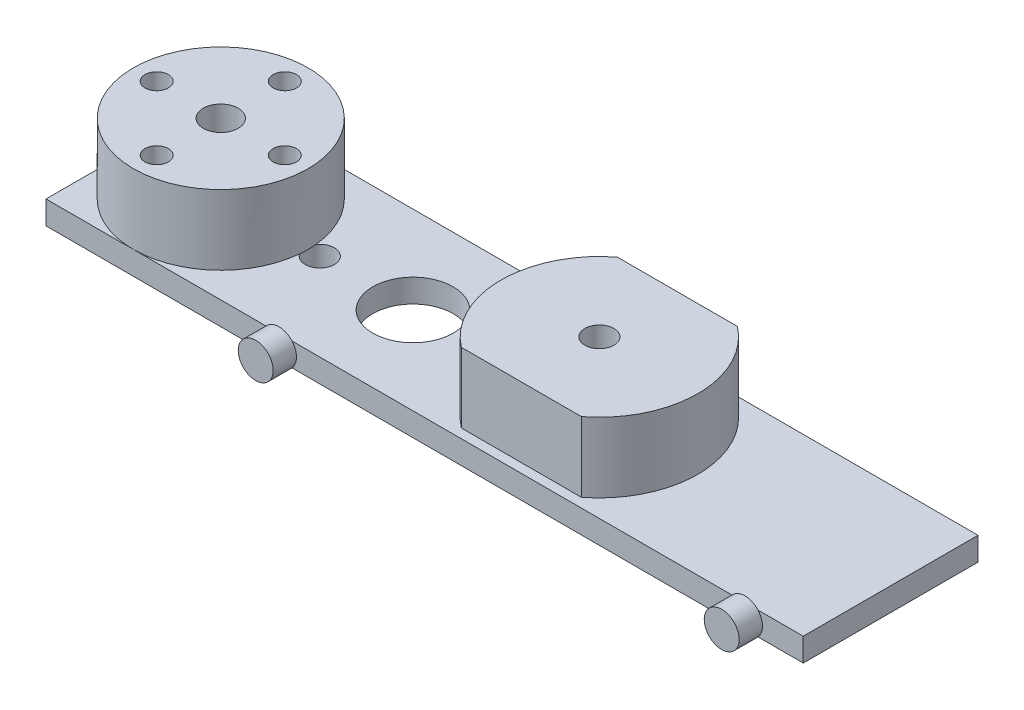
ISO-10303-21;
HEADER;
FILE_DESCRIPTION(('STEP AP214'),'2;1');
FILE_NAME('part.step','',(''),(''),'','','');
FILE_SCHEMA(('AUTOMOTIVE_DESIGN { 1 0 10303 214 1 1 1 1 }'));
ENDSEC;
DATA;
#1=APPLICATION_CONTEXT('core data for automotive mechanical design processes');
#2=APPLICATION_PROTOCOL_DEFINITION('international standard','automotive_design',2000,#1);
#3=PRODUCT_CONTEXT('',#1,'mechanical');
#4=PRODUCT('Part','Part','',(#3));
#5=PRODUCT_RELATED_PRODUCT_CATEGORY('part','',(#4));
#6=PRODUCT_DEFINITION_FORMATION('','',#4);
#7=PRODUCT_DEFINITION_CONTEXT('part definition',#1,'design');
#8=PRODUCT_DEFINITION('design','',#6,#7);
#9=PRODUCT_DEFINITION_SHAPE('','',#8);
#10=(LENGTH_UNIT() NAMED_UNIT(*) SI_UNIT(.MILLI.,.METRE.));
#11=(NAMED_UNIT(*) PLANE_ANGLE_UNIT() SI_UNIT($,.RADIAN.));
#12=(NAMED_UNIT(*) SI_UNIT($,.STERADIAN.) SOLID_ANGLE_UNIT());
#13=UNCERTAINTY_MEASURE_WITH_UNIT(LENGTH_MEASURE(1.E-05),#10,'distance_accuracy_value','');
#14=(GEOMETRIC_REPRESENTATION_CONTEXT(3) GLOBAL_UNCERTAINTY_ASSIGNED_CONTEXT((#13)) GLOBAL_UNIT_ASSIGNED_CONTEXT((#10,
#11,#12)) REPRESENTATION_CONTEXT('',''));
#15=CARTESIAN_POINT('',(0.,0.,0.));
#16=DIRECTION('',(0.,0.,1.));
#17=DIRECTION('',(1.,0.,0.));
#18=AXIS2_PLACEMENT_3D('',#15,#16,#17);
#19=CARTESIAN_POINT('',(0.,0.,0.));
#20=DIRECTION('',(0.,1.,0.));
#21=DIRECTION('',(0.,0.,1.));
#22=AXIS2_PLACEMENT_3D('',#19,#20,#21);
#23=PLANE('',#22);
#24=DIRECTION('',(0.,0.,-1.));
#25=VECTOR('',#24,1.);
#26=CARTESIAN_POINT('',(-40.,0.,0.));
#27=LINE('',#26,#25);
#28=CARTESIAN_POINT('',(-40.,0.,7.5));
#29=VERTEX_POINT('',#28);
#30=CARTESIAN_POINT('',(-40.,0.,-7.5));
#31=VERTEX_POINT('',#30);
#32=EDGE_CURVE('E406',#29,#31,#27,.T.);
#33=ORIENTED_EDGE('',*,*,#32,.T.);
#34=DIRECTION('',(-1.,0.,0.));
#35=VECTOR('',#34,1.);
#36=CARTESIAN_POINT('',(0.,0.,-7.5));
#37=LINE('',#36,#35);
#38=CARTESIAN_POINT('',(25.,0.,-7.5));
#39=VERTEX_POINT('',#38);
#40=EDGE_CURVE('E416',#39,#31,#37,.T.);
#41=ORIENTED_EDGE('',*,*,#40,.F.);
#42=DIRECTION('',(0.,0.,1.));
#43=VECTOR('',#42,1.);
#44=CARTESIAN_POINT('',(25.,0.,-7.5));
#45=LINE('',#44,#43);
#46=CARTESIAN_POINT('',(25.,0.,7.5));
#47=VERTEX_POINT('',#46);
#48=EDGE_CURVE('E382',#39,#47,#45,.T.);
#49=ORIENTED_EDGE('',*,*,#48,.T.);
#50=DIRECTION('',(-1.,0.,0.));
#51=VECTOR('',#50,1.);
#52=CARTESIAN_POINT('',(0.,0.,7.5));
#53=LINE('',#52,#51);
#54=CARTESIAN_POINT('',(21.1180339887499,0.,7.5));
#55=VERTEX_POINT('',#54);
#56=EDGE_CURVE('E412',#47,#55,#53,.T.);
#57=ORIENTED_EDGE('',*,*,#56,.T.);
#58=CARTESIAN_POINT('',(18.8819660112501,0.,7.5));
#59=VERTEX_POINT('',#58);
#60=EDGE_CURVE('E417',#55,#59,#53,.T.);
#61=ORIENTED_EDGE('',*,*,#60,.T.);
#62=CARTESIAN_POINT('',(-18.8819660112501,0.,7.5));
#63=VERTEX_POINT('',#62);
#64=EDGE_CURVE('E662',#59,#63,#53,.T.);
#65=ORIENTED_EDGE('',*,*,#64,.T.);
#66=CARTESIAN_POINT('',(-21.1180339887499,0.,7.5));
#67=VERTEX_POINT('',#66);
#68=EDGE_CURVE('E618',#63,#67,#53,.T.);
#69=ORIENTED_EDGE('',*,*,#68,.T.);
#70=EDGE_CURVE('E410',#67,#29,#53,.T.);
#71=ORIENTED_EDGE('',*,*,#70,.T.);
#72=EDGE_LOOP('',(#33,#41,#49,#57,#61,#65,#69,#71));
#73=FACE_BOUND('',#72,.T.);
#74=CARTESIAN_POINT('',(-24.,0.,0.));
#75=DIRECTION('',(0.,-1.,0.));
#76=DIRECTION('',(0.,0.,-1.));
#77=AXIS2_PLACEMENT_3D('',#74,#75,#76);
#78=CIRCLE('',#77,1.25);
#79=CARTESIAN_POINT('',(-24.,0.,-1.25));
#80=VERTEX_POINT('',#79);
#81=EDGE_CURVE('E377',#80,#80,#78,.T.);
#82=ORIENTED_EDGE('',*,*,#81,.F.);
#83=EDGE_LOOP('',(#82));
#84=FACE_BOUND('',#83,.T.);
#85=CARTESIAN_POINT('',(-16.,0.,0.));
#86=DIRECTION('',(0.,-1.,0.));
#87=DIRECTION('',(0.,0.,-1.));
#88=AXIS2_PLACEMENT_3D('',#85,#86,#87);
#89=CIRCLE('',#88,3.45);
#90=CARTESIAN_POINT('',(-16.,0.,-3.45));
#91=VERTEX_POINT('',#90);
#92=EDGE_CURVE('E386',#91,#91,#89,.T.);
#93=ORIENTED_EDGE('',*,*,#92,.F.);
#94=EDGE_LOOP('',(#93));
#95=FACE_BOUND('',#94,.T.);
#96=CARTESIAN_POINT('',(-32.5,0.,0.));
#97=DIRECTION('',(0.,1.,0.));
#98=DIRECTION('',(0.,0.,1.));
#99=AXIS2_PLACEMENT_3D('',#96,#97,#98);
#100=CIRCLE('',#99,7.2);
#101=CARTESIAN_POINT('',(-32.5,0.,7.2));
#102=VERTEX_POINT('',#101);
#103=EDGE_CURVE('E289',#102,#102,#100,.T.);
#104=ORIENTED_EDGE('',*,*,#103,.T.);
#105=EDGE_LOOP('',(#104));
#106=FACE_BOUND('',#105,.T.);
#107=DIRECTION('',(-1.,0.,0.));
#108=VECTOR('',#107,1.);
#109=CARTESIAN_POINT('',(0.,0.,6.));
#110=LINE('',#109,#108);
#111=CARTESIAN_POINT('',(4.90535421758714,0.,6.));
#112=VERTEX_POINT('',#111);
#113=CARTESIAN_POINT('',(-4.90535421758714,0.,6.));
#114=VERTEX_POINT('',#113);
#115=EDGE_CURVE('E13',#112,#114,#110,.T.);
#116=ORIENTED_EDGE('',*,*,#115,.F.);
#117=CARTESIAN_POINT('',(0.,0.,0.));
#118=DIRECTION('',(0.,1.,0.));
#119=DIRECTION('',(0.,0.,1.));
#120=AXIS2_PLACEMENT_3D('',#117,#118,#119);
#121=CIRCLE('',#120,7.75);
#122=CARTESIAN_POINT('',(4.90535421758714,0.,-6.));
#123=VERTEX_POINT('',#122);
#124=EDGE_CURVE('E444',#112,#123,#121,.T.);
#125=ORIENTED_EDGE('',*,*,#124,.T.);
#126=DIRECTION('',(-1.,0.,0.));
#127=VECTOR('',#126,1.);
#128=CARTESIAN_POINT('',(0.,0.,-6.));
#129=LINE('',#128,#127);
#130=CARTESIAN_POINT('',(-4.90535421758714,0.,-6.));
#131=VERTEX_POINT('',#130);
#132=EDGE_CURVE('E448',#123,#131,#129,.T.);
#133=ORIENTED_EDGE('',*,*,#132,.T.);
#134=CARTESIAN_POINT('',(0.,0.,0.));
#135=DIRECTION('',(0.,1.,0.));
#136=DIRECTION('',(0.,0.,1.));
#137=AXIS2_PLACEMENT_3D('',#134,#135,#136);
#138=CIRCLE('',#137,7.75);
#139=EDGE_CURVE('E131',#131,#114,#138,.T.);
#140=ORIENTED_EDGE('',*,*,#139,.T.);
#141=EDGE_LOOP('',(#116,#125,#133,#140));
#142=FACE_BOUND('',#141,.T.);
#143=ADVANCED_FACE('F121',(#73,#84,#95,#106,#142),#23,.F.);
#144=CARTESIAN_POINT('',(0.,2.,0.));
#145=DIRECTION('',(0.,1.,0.));
#146=DIRECTION('',(0.,0.,1.));
#147=AXIS2_PLACEMENT_3D('',#144,#145,#146);
#148=PLANE('',#147);
#149=CARTESIAN_POINT('',(-16.,2.,0.));
#150=DIRECTION('',(0.,1.,0.));
#151=DIRECTION('',(0.,0.,1.));
#152=AXIS2_PLACEMENT_3D('',#149,#150,#151);
#153=CIRCLE('',#152,3.45);
#154=CARTESIAN_POINT('',(-16.,2.,3.45));
#155=VERTEX_POINT('',#154);
#156=EDGE_CURVE('E357',#155,#155,#153,.F.);
#157=ORIENTED_EDGE('',*,*,#156,.T.);
#158=EDGE_LOOP('',(#157));
#159=FACE_BOUND('',#158,.T.);
#160=DIRECTION('',(-1.,0.,0.));
#161=VECTOR('',#160,1.);
#162=CARTESIAN_POINT('',(5.14902903468217,2.,-6.7));
#163=LINE('',#162,#161);
#164=CARTESIAN_POINT('',(5.14902903468217,2.,-6.7));
#165=VERTEX_POINT('',#164);
#166=CARTESIAN_POINT('',(-5.14902903468217,2.,-6.7));
#167=VERTEX_POINT('',#166);
#168=EDGE_CURVE('E335',#165,#167,#163,.T.);
#169=ORIENTED_EDGE('',*,*,#168,.F.);
#170=CARTESIAN_POINT('',(0.,2.,0.));
#171=DIRECTION('',(0.,1.,0.));
#172=DIRECTION('',(0.,0.,1.));
#173=AXIS2_PLACEMENT_3D('',#170,#171,#172);
#174=CIRCLE('',#173,8.45);
#175=CARTESIAN_POINT('',(5.14902903468217,2.,6.7));
#176=VERTEX_POINT('',#175);
#177=EDGE_CURVE('E338',#176,#165,#174,.T.);
#178=ORIENTED_EDGE('',*,*,#177,.F.);
#179=DIRECTION('',(1.,0.,0.));
#180=VECTOR('',#179,1.);
#181=CARTESIAN_POINT('',(5.14902903468217,2.,6.7));
#182=LINE('',#181,#180);
#183=CARTESIAN_POINT('',(-5.14902903468217,2.,6.7));
#184=VERTEX_POINT('',#183);
#185=EDGE_CURVE('E328',#184,#176,#182,.T.);
#186=ORIENTED_EDGE('',*,*,#185,.F.);
#187=CARTESIAN_POINT('',(0.,2.,0.));
#188=DIRECTION('',(0.,1.,0.));
#189=DIRECTION('',(0.,0.,1.));
#190=AXIS2_PLACEMENT_3D('',#187,#188,#189);
#191=CIRCLE('',#190,8.45);
#192=EDGE_CURVE('E331',#167,#184,#191,.T.);
#193=ORIENTED_EDGE('',*,*,#192,.F.);
#194=EDGE_LOOP('',(#169,#178,#186,#193));
#195=FACE_BOUND('',#194,.T.);
#196=DIRECTION('',(-1.,0.,0.));
#197=VECTOR('',#196,1.);
#198=CARTESIAN_POINT('',(0.,2.,-7.5));
#199=LINE('',#198,#197);
#200=CARTESIAN_POINT('',(25.,2.,-7.5));
#201=VERTEX_POINT('',#200);
#202=CARTESIAN_POINT('',(-32.5,2.,-7.5));
#203=VERTEX_POINT('',#202);
#204=EDGE_CURVE('E401',#201,#203,#199,.T.);
#205=ORIENTED_EDGE('',*,*,#204,.T.);
#206=CARTESIAN_POINT('',(-32.5,2.,0.));
#207=DIRECTION('',(0.,1.,0.));
#208=DIRECTION('',(0.,0.,1.));
#209=AXIS2_PLACEMENT_3D('',#206,#207,#208);
#210=CIRCLE('',#209,7.5);
#211=CARTESIAN_POINT('',(-25.0330882352941,2.,-0.703724873865408));
#212=VERTEX_POINT('',#211);
#213=EDGE_CURVE('E672',#212,#203,#210,.T.);
#214=ORIENTED_EDGE('',*,*,#213,.F.);
#215=CARTESIAN_POINT('',(-24.,2.,0.));
#216=DIRECTION('',(0.,1.,0.));
#217=DIRECTION('',(0.,0.,1.));
#218=AXIS2_PLACEMENT_3D('',#215,#216,#217);
#219=CIRCLE('',#218,1.25);
#220=CARTESIAN_POINT('',(-25.0330882352941,2.,0.703724873865418));
#221=VERTEX_POINT('',#220);
#222=EDGE_CURVE('E378',#212,#221,#219,.F.);
#223=ORIENTED_EDGE('',*,*,#222,.T.);
#224=CARTESIAN_POINT('',(-32.5,2.,7.5));
#225=VERTEX_POINT('',#224);
#226=EDGE_CURVE('E309',#225,#221,#210,.T.);
#227=ORIENTED_EDGE('',*,*,#226,.F.);
#228=DIRECTION('',(-1.,0.,0.));
#229=VECTOR('',#228,1.);
#230=CARTESIAN_POINT('',(0.,2.,7.5));
#231=LINE('',#230,#229);
#232=CARTESIAN_POINT('',(-21.1180339887499,2.,7.5));
#233=VERTEX_POINT('',#232);
#234=EDGE_CURVE('E625',#233,#225,#231,.T.);
#235=ORIENTED_EDGE('',*,*,#234,.F.);
#236=CARTESIAN_POINT('',(-18.8819660112501,2.,7.5));
#237=VERTEX_POINT('',#236);
#238=EDGE_CURVE('E630',#237,#233,#231,.T.);
#239=ORIENTED_EDGE('',*,*,#238,.F.);
#240=CARTESIAN_POINT('',(18.8819660112501,2.,7.5));
#241=VERTEX_POINT('',#240);
#242=EDGE_CURVE('E633',#241,#237,#231,.T.);
#243=ORIENTED_EDGE('',*,*,#242,.F.);
#244=CARTESIAN_POINT('',(21.1180339887499,2.,7.5));
#245=VERTEX_POINT('',#244);
#246=EDGE_CURVE('E400',#245,#241,#231,.T.);
#247=ORIENTED_EDGE('',*,*,#246,.F.);
#248=CARTESIAN_POINT('',(25.,2.,7.5));
#249=VERTEX_POINT('',#248);
#250=EDGE_CURVE('E396',#249,#245,#231,.T.);
#251=ORIENTED_EDGE('',*,*,#250,.F.);
#252=DIRECTION('',(0.,0.,1.));
#253=VECTOR('',#252,1.);
#254=CARTESIAN_POINT('',(25.,2.,-7.5));
#255=LINE('',#254,#253);
#256=EDGE_CURVE('E427',#201,#249,#255,.T.);
#257=ORIENTED_EDGE('',*,*,#256,.F.);
#258=EDGE_LOOP('',(#205,#214,#223,#227,#235,#239,#243,#247,#251,#257));
#259=FACE_BOUND('',#258,.T.);
#260=ADVANCED_FACE('F499',(#159,#195,#259),#148,.T.);
#261=DIRECTION('',(0.,0.,-1.));
#262=VECTOR('',#261,1.);
#263=CARTESIAN_POINT('',(-40.,2.,0.));
#264=LINE('',#263,#262);
#265=CARTESIAN_POINT('',(-40.,2.,0.));
#266=VERTEX_POINT('',#265);
#267=CARTESIAN_POINT('',(-40.,2.,-7.5));
#268=VERTEX_POINT('',#267);
#269=EDGE_CURVE('E395',#266,#268,#264,.T.);
#270=ORIENTED_EDGE('',*,*,#269,.F.);
#271=EDGE_CURVE('E679',#203,#266,#210,.T.);
#272=ORIENTED_EDGE('',*,*,#271,.F.);
#273=EDGE_CURVE('E399',#203,#268,#199,.T.);
#274=ORIENTED_EDGE('',*,*,#273,.T.);
#275=EDGE_LOOP('',(#270,#272,#274));
#276=FACE_BOUND('',#275,.T.);
#277=ADVANCED_FACE('F590',(#276),#148,.T.);
#278=CARTESIAN_POINT('',(-40.,2.,7.5));
#279=VERTEX_POINT('',#278);
#280=EDGE_CURVE('E394',#225,#279,#231,.T.);
#281=ORIENTED_EDGE('',*,*,#280,.F.);
#282=EDGE_CURVE('E314',#266,#225,#210,.T.);
#283=ORIENTED_EDGE('',*,*,#282,.F.);
#284=EDGE_CURVE('E390',#279,#266,#264,.T.);
#285=ORIENTED_EDGE('',*,*,#284,.F.);
#286=EDGE_LOOP('',(#281,#283,#285));
#287=FACE_BOUND('',#286,.T.);
#288=ADVANCED_FACE('F592',(#287),#148,.T.);
#289=CARTESIAN_POINT('',(0.,2.,7.5));
#290=DIRECTION('',(0.,0.,1.));
#291=DIRECTION('',(1.,0.,0.));
#292=AXIS2_PLACEMENT_3D('',#289,#290,#291);
#293=PLANE('',#292);
#294=CARTESIAN_POINT('',(20.,0.999999999999999,7.5));
#295=DIRECTION('',(0.,0.,1.));
#296=DIRECTION('',(1.,0.,0.));
#297=AXIS2_PLACEMENT_3D('',#294,#295,#296);
#298=CIRCLE('',#297,1.5);
#299=EDGE_CURVE('E449',#241,#59,#298,.T.);
#300=ORIENTED_EDGE('',*,*,#299,.F.);
#301=ORIENTED_EDGE('',*,*,#242,.T.);
#302=CARTESIAN_POINT('',(-20.,0.999999999999995,7.5));
#303=DIRECTION('',(0.,0.,1.));
#304=DIRECTION('',(1.,0.,0.));
#305=AXIS2_PLACEMENT_3D('',#302,#303,#304);
#306=CIRCLE('',#305,1.5);
#307=EDGE_CURVE('E369',#63,#237,#306,.T.);
#308=ORIENTED_EDGE('',*,*,#307,.F.);
#309=ORIENTED_EDGE('',*,*,#64,.F.);
#310=EDGE_LOOP('',(#300,#301,#308,#309));
#311=FACE_BOUND('',#310,.T.);
#312=ADVANCED_FACE('F602',(#311),#293,.T.);
#313=EDGE_CURVE('E652',#233,#67,#306,.T.);
#314=ORIENTED_EDGE('',*,*,#313,.F.);
#315=ORIENTED_EDGE('',*,*,#234,.T.);
#316=ORIENTED_EDGE('',*,*,#280,.T.);
#317=DIRECTION('',(0.,-1.,0.));
#318=VECTOR('',#317,1.);
#319=CARTESIAN_POINT('',(-40.,2.,7.5));
#320=LINE('',#319,#318);
#321=EDGE_CURVE('E423',#279,#29,#320,.T.);
#322=ORIENTED_EDGE('',*,*,#321,.T.);
#323=ORIENTED_EDGE('',*,*,#70,.F.);
#324=EDGE_LOOP('',(#314,#315,#316,#322,#323));
#325=FACE_BOUND('',#324,.T.);
#326=ADVANCED_FACE('F598',(#325),#293,.T.);
#327=CARTESIAN_POINT('',(0.,2.,-7.5));
#328=DIRECTION('',(0.,0.,1.));
#329=DIRECTION('',(1.,0.,0.));
#330=AXIS2_PLACEMENT_3D('',#327,#328,#329);
#331=PLANE('',#330);
#332=ORIENTED_EDGE('',*,*,#40,.T.);
#333=DIRECTION('',(0.,-1.,0.));
#334=VECTOR('',#333,1.);
#335=CARTESIAN_POINT('',(-40.,2.,-7.5));
#336=LINE('',#335,#334);
#337=EDGE_CURVE('E405',#268,#31,#336,.T.);
#338=ORIENTED_EDGE('',*,*,#337,.F.);
#339=ORIENTED_EDGE('',*,*,#273,.F.);
#340=ORIENTED_EDGE('',*,*,#204,.F.);
#341=DIRECTION('',(0.,-1.,0.));
#342=VECTOR('',#341,1.);
#343=CARTESIAN_POINT('',(25.,2.,-7.5));
#344=LINE('',#343,#342);
#345=EDGE_CURVE('E431',#201,#39,#344,.T.);
#346=ORIENTED_EDGE('',*,*,#345,.T.);
#347=EDGE_LOOP('',(#332,#338,#339,#340,#346));
#348=FACE_BOUND('',#347,.T.);
#349=ADVANCED_FACE('F594',(#348),#331,.F.);
#350=EDGE_CURVE('E363',#55,#245,#298,.T.);
#351=ORIENTED_EDGE('',*,*,#350,.F.);
#352=ORIENTED_EDGE('',*,*,#56,.F.);
#353=DIRECTION('',(0.,-1.,0.));
#354=VECTOR('',#353,1.);
#355=CARTESIAN_POINT('',(25.,2.,7.5));
#356=LINE('',#355,#354);
#357=EDGE_CURVE('E411',#249,#47,#356,.T.);
#358=ORIENTED_EDGE('',*,*,#357,.F.);
#359=ORIENTED_EDGE('',*,*,#250,.T.);
#360=EDGE_LOOP('',(#351,#352,#358,#359));
#361=FACE_BOUND('',#360,.T.);
#362=ADVANCED_FACE('F597',(#361),#293,.T.);
#363=CARTESIAN_POINT('',(-40.,2.,0.));
#364=DIRECTION('',(-1.,0.,0.));
#365=DIRECTION('',(0.,0.,1.));
#366=AXIS2_PLACEMENT_3D('',#363,#364,#365);
#367=PLANE('',#366);
#368=ORIENTED_EDGE('',*,*,#32,.F.);
#369=ORIENTED_EDGE('',*,*,#321,.F.);
#370=ORIENTED_EDGE('',*,*,#284,.T.);
#371=ORIENTED_EDGE('',*,*,#269,.T.);
#372=ORIENTED_EDGE('',*,*,#337,.T.);
#373=EDGE_LOOP('',(#368,#369,#370,#371,#372));
#374=FACE_BOUND('',#373,.T.);
#375=ADVANCED_FACE('F585',(#374),#367,.T.);
#376=CARTESIAN_POINT('',(25.,2.,-7.5));
#377=DIRECTION('',(1.,0.,0.));
#378=DIRECTION('',(0.,0.,-1.));
#379=AXIS2_PLACEMENT_3D('',#376,#377,#378);
#380=PLANE('',#379);
#381=ORIENTED_EDGE('',*,*,#48,.F.);
#382=ORIENTED_EDGE('',*,*,#345,.F.);
#383=ORIENTED_EDGE('',*,*,#256,.T.);
#384=ORIENTED_EDGE('',*,*,#357,.T.);
#385=EDGE_LOOP('',(#381,#382,#383,#384));
#386=FACE_BOUND('',#385,.T.);
#387=ADVANCED_FACE('F123',(#386),#380,.T.);
#388=CARTESIAN_POINT('',(-24.,11.7580735803744,0.));
#389=DIRECTION('',(0.,-1.,0.));
#390=DIRECTION('',(0.,0.,-1.));
#391=AXIS2_PLACEMENT_3D('',#388,#389,#390);
#392=CYLINDRICAL_SURFACE('',#391,1.25);
#393=ORIENTED_EDGE('',*,*,#81,.T.);
#394=EDGE_LOOP('',(#393));
#395=FACE_BOUND('',#394,.T.);
#396=EDGE_CURVE('E373',#221,#212,#219,.F.);
#397=ORIENTED_EDGE('',*,*,#396,.F.);
#398=ORIENTED_EDGE('',*,*,#222,.F.);
#399=EDGE_LOOP('',(#397,#398));
#400=FACE_BOUND('',#399,.T.);
#401=ADVANCED_FACE('F581',(#395,#400),#392,.F.);
#402=CARTESIAN_POINT('',(-16.,11.7580735803744,0.));
#403=DIRECTION('',(0.,-1.,0.));
#404=DIRECTION('',(0.,0.,-1.));
#405=AXIS2_PLACEMENT_3D('',#402,#403,#404);
#406=CYLINDRICAL_SURFACE('',#405,3.45);
#407=ORIENTED_EDGE('',*,*,#92,.T.);
#408=EDGE_LOOP('',(#407));
#409=FACE_BOUND('',#408,.T.);
#410=ORIENTED_EDGE('',*,*,#156,.F.);
#411=EDGE_LOOP('',(#410));
#412=FACE_BOUND('',#411,.T.);
#413=ADVANCED_FACE('F579',(#409,#412),#406,.F.);
#414=CARTESIAN_POINT('',(0.,11.7580735803744,0.));
#415=DIRECTION('',(0.,-1.,0.));
#416=DIRECTION('',(0.,0.,-1.));
#417=AXIS2_PLACEMENT_3D('',#414,#415,#416);
#418=CYLINDRICAL_SURFACE('',#417,1.25);
#419=CARTESIAN_POINT('',(0.,5.5,0.));
#420=DIRECTION('',(0.,1.,0.));
#421=DIRECTION('',(0.,0.,1.));
#422=AXIS2_PLACEMENT_3D('',#419,#420,#421);
#423=CIRCLE('',#422,1.25);
#424=CARTESIAN_POINT('',(0.,5.5,1.25));
#425=VERTEX_POINT('',#424);
#426=EDGE_CURVE('E274',#425,#425,#423,.F.);
#427=ORIENTED_EDGE('',*,*,#426,.T.);
#428=EDGE_LOOP('',(#427));
#429=FACE_BOUND('',#428,.T.);
#430=CARTESIAN_POINT('',(0.,8.,0.));
#431=DIRECTION('',(0.,1.,0.));
#432=DIRECTION('',(0.,0.,1.));
#433=AXIS2_PLACEMENT_3D('',#430,#431,#432);
#434=CIRCLE('',#433,1.25);
#435=CARTESIAN_POINT('',(0.,8.,1.25));
#436=VERTEX_POINT('',#435);
#437=EDGE_CURVE('E299',#436,#436,#434,.F.);
#438=ORIENTED_EDGE('',*,*,#437,.F.);
#439=EDGE_LOOP('',(#438));
#440=FACE_BOUND('',#439,.T.);
#441=ADVANCED_FACE('F576',(#429,#440),#418,.F.);
#442=CARTESIAN_POINT('',(-20.,0.999999999999995,7.5));
#443=DIRECTION('',(0.,0.,1.));
#444=DIRECTION('',(1.,0.,0.));
#445=AXIS2_PLACEMENT_3D('',#442,#443,#444);
#446=PLANE('',#445);
#447=EDGE_CURVE('E364',#237,#233,#306,.T.);
#448=ORIENTED_EDGE('',*,*,#447,.F.);
#449=ORIENTED_EDGE('',*,*,#238,.T.);
#450=EDGE_LOOP('',(#448,#449));
#451=FACE_BOUND('',#450,.T.);
#452=ADVANCED_FACE('F567',(#451),#446,.F.);
#453=CARTESIAN_POINT('',(-20.,0.999999999999995,9.5));
#454=DIRECTION('',(0.,0.,-1.));
#455=DIRECTION('',(-1.,0.,0.));
#456=AXIS2_PLACEMENT_3D('',#453,#454,#455);
#457=CYLINDRICAL_SURFACE('',#456,1.5);
#458=CARTESIAN_POINT('',(-20.,0.999999999999995,9.5));
#459=DIRECTION('',(0.,0.,1.));
#460=DIRECTION('',(1.,0.,0.));
#461=AXIS2_PLACEMENT_3D('',#458,#459,#460);
#462=CIRCLE('',#461,1.5);
#463=CARTESIAN_POINT('',(-18.5,0.999999999999995,9.5));
#464=VERTEX_POINT('',#463);
#465=EDGE_CURVE('E308',#464,#464,#462,.T.);
#466=ORIENTED_EDGE('',*,*,#465,.F.);
#467=EDGE_LOOP('',(#466));
#468=FACE_BOUND('',#467,.T.);
#469=ORIENTED_EDGE('',*,*,#447,.T.);
#470=ORIENTED_EDGE('',*,*,#313,.T.);
#471=EDGE_CURVE('E368',#67,#63,#306,.T.);
#472=ORIENTED_EDGE('',*,*,#471,.T.);
#473=ORIENTED_EDGE('',*,*,#307,.T.);
#474=EDGE_LOOP('',(#469,#470,#472,#473));
#475=FACE_BOUND('',#474,.T.);
#476=ADVANCED_FACE('F563',(#468,#475),#457,.T.);
#477=CARTESIAN_POINT('',(-20.,0.999999999999995,9.5));
#478=DIRECTION('',(0.,0.,1.));
#479=DIRECTION('',(1.,0.,0.));
#480=AXIS2_PLACEMENT_3D('',#477,#478,#479);
#481=PLANE('',#480);
#482=ORIENTED_EDGE('',*,*,#465,.T.);
#483=EDGE_LOOP('',(#482));
#484=FACE_BOUND('',#483,.T.);
#485=ADVANCED_FACE('F566',(#484),#481,.T.);
#486=ORIENTED_EDGE('',*,*,#68,.F.);
#487=ORIENTED_EDGE('',*,*,#471,.F.);
#488=EDGE_LOOP('',(#486,#487));
#489=FACE_BOUND('',#488,.T.);
#490=ADVANCED_FACE('F569',(#489),#446,.F.);
#491=CARTESIAN_POINT('',(20.,0.999999999999999,7.5));
#492=DIRECTION('',(0.,0.,1.));
#493=DIRECTION('',(1.,0.,0.));
#494=AXIS2_PLACEMENT_3D('',#491,#492,#493);
#495=PLANE('',#494);
#496=EDGE_CURVE('E358',#245,#241,#298,.T.);
#497=ORIENTED_EDGE('',*,*,#496,.F.);
#498=ORIENTED_EDGE('',*,*,#246,.T.);
#499=EDGE_LOOP('',(#497,#498));
#500=FACE_BOUND('',#499,.T.);
#501=ADVANCED_FACE('F559',(#500),#495,.F.);
#502=CARTESIAN_POINT('',(20.,0.999999999999999,9.5));
#503=DIRECTION('',(0.,0.,-1.));
#504=DIRECTION('',(-1.,0.,0.));
#505=AXIS2_PLACEMENT_3D('',#502,#503,#504);
#506=CYLINDRICAL_SURFACE('',#505,1.5);
#507=CARTESIAN_POINT('',(20.,0.999999999999999,9.5));
#508=DIRECTION('',(0.,0.,1.));
#509=DIRECTION('',(1.,0.,0.));
#510=AXIS2_PLACEMENT_3D('',#507,#508,#509);
#511=CIRCLE('',#510,1.5);
#512=CARTESIAN_POINT('',(21.5,0.999999999999999,9.5));
#513=VERTEX_POINT('',#512);
#514=EDGE_CURVE('E353',#513,#513,#511,.T.);
#515=ORIENTED_EDGE('',*,*,#514,.F.);
#516=EDGE_LOOP('',(#515));
#517=FACE_BOUND('',#516,.T.);
#518=ORIENTED_EDGE('',*,*,#496,.T.);
#519=ORIENTED_EDGE('',*,*,#299,.T.);
#520=EDGE_CURVE('E362',#59,#55,#298,.T.);
#521=ORIENTED_EDGE('',*,*,#520,.T.);
#522=ORIENTED_EDGE('',*,*,#350,.T.);
#523=EDGE_LOOP('',(#518,#519,#521,#522));
#524=FACE_BOUND('',#523,.T.);
#525=ADVANCED_FACE('F554',(#517,#524),#506,.T.);
#526=CARTESIAN_POINT('',(20.,0.999999999999999,9.5));
#527=DIRECTION('',(0.,0.,1.));
#528=DIRECTION('',(1.,0.,0.));
#529=AXIS2_PLACEMENT_3D('',#526,#527,#528);
#530=PLANE('',#529);
#531=ORIENTED_EDGE('',*,*,#514,.T.);
#532=EDGE_LOOP('',(#531));
#533=FACE_BOUND('',#532,.T.);
#534=ADVANCED_FACE('F551',(#533),#530,.T.);
#535=ORIENTED_EDGE('',*,*,#60,.F.);
#536=ORIENTED_EDGE('',*,*,#520,.F.);
#537=EDGE_LOOP('',(#535,#536));
#538=FACE_BOUND('',#537,.T.);
#539=ADVANCED_FACE('F528',(#538),#495,.F.);
#540=CARTESIAN_POINT('',(-32.5,2.,0.));
#541=DIRECTION('',(0.,1.,0.));
#542=DIRECTION('',(0.,0.,1.));
#543=AXIS2_PLACEMENT_3D('',#540,#541,#542);
#544=PLANE('',#543);
#545=EDGE_CURVE('E313',#221,#212,#210,.T.);
#546=ORIENTED_EDGE('',*,*,#545,.F.);
#547=ORIENTED_EDGE('',*,*,#396,.T.);
#548=EDGE_LOOP('',(#546,#547));
#549=FACE_BOUND('',#548,.T.);
#550=ADVANCED_FACE('F524',(#549),#544,.F.);
#551=CARTESIAN_POINT('',(-32.5,8.,0.));
#552=DIRECTION('',(0.,1.,0.));
#553=DIRECTION('',(0.,0.,1.));
#554=AXIS2_PLACEMENT_3D('',#551,#552,#553);
#555=PLANE('',#554);
#556=CARTESIAN_POINT('',(-32.5,8.,-5.5));
#557=DIRECTION('',(0.,1.,0.));
#558=DIRECTION('',(0.,0.,1.));
#559=AXIS2_PLACEMENT_3D('',#556,#557,#558);
#560=CIRCLE('',#559,0.999999999999991);
#561=CARTESIAN_POINT('',(-32.5,8.,-4.50000000000001));
#562=VERTEX_POINT('',#561);
#563=EDGE_CURVE('E995',#562,#562,#560,.T.);
#564=ORIENTED_EDGE('',*,*,#563,.F.);
#565=EDGE_LOOP('',(#564));
#566=FACE_BOUND('',#565,.T.);
#567=CARTESIAN_POINT('',(-38.,8.,0.));
#568=DIRECTION('',(0.,1.,0.));
#569=DIRECTION('',(0.,0.,1.));
#570=AXIS2_PLACEMENT_3D('',#567,#568,#569);
#571=CIRCLE('',#570,0.999999999999991);
#572=CARTESIAN_POINT('',(-38.,8.,0.999999999999992));
#573=VERTEX_POINT('',#572);
#574=EDGE_CURVE('E997',#573,#573,#571,.T.);
#575=ORIENTED_EDGE('',*,*,#574,.F.);
#576=EDGE_LOOP('',(#575));
#577=FACE_BOUND('',#576,.T.);
#578=CARTESIAN_POINT('',(-32.5,8.,5.5));
#579=DIRECTION('',(0.,1.,0.));
#580=DIRECTION('',(0.,0.,1.));
#581=AXIS2_PLACEMENT_3D('',#578,#579,#580);
#582=CIRCLE('',#581,0.999999999999998);
#583=CARTESIAN_POINT('',(-32.5,8.,6.5));
#584=VERTEX_POINT('',#583);
#585=EDGE_CURVE('E1003',#584,#584,#582,.T.);
#586=ORIENTED_EDGE('',*,*,#585,.F.);
#587=EDGE_LOOP('',(#586));
#588=FACE_BOUND('',#587,.T.);
#589=CARTESIAN_POINT('',(-27.,8.,0.));
#590=DIRECTION('',(0.,1.,0.));
#591=DIRECTION('',(0.,0.,1.));
#592=AXIS2_PLACEMENT_3D('',#589,#590,#591);
#593=CIRCLE('',#592,0.999999999999998);
#594=CARTESIAN_POINT('',(-27.,8.,0.999999999999999));
#595=VERTEX_POINT('',#594);
#596=EDGE_CURVE('E1006',#595,#595,#593,.T.);
#597=ORIENTED_EDGE('',*,*,#596,.F.);
#598=EDGE_LOOP('',(#597));
#599=FACE_BOUND('',#598,.T.);
#600=CARTESIAN_POINT('',(-32.5,8.,0.));
#601=DIRECTION('',(0.,1.,0.));
#602=DIRECTION('',(0.,0.,1.));
#603=AXIS2_PLACEMENT_3D('',#600,#601,#602);
#604=CIRCLE('',#603,1.5);
#605=CARTESIAN_POINT('',(-32.5,8.,1.50000000000001));
#606=VERTEX_POINT('',#605);
#607=EDGE_CURVE('E459',#606,#606,#604,.T.);
#608=ORIENTED_EDGE('',*,*,#607,.F.);
#609=EDGE_LOOP('',(#608));
#610=FACE_BOUND('',#609,.T.);
#611=CARTESIAN_POINT('',(-32.5,8.,0.));
#612=DIRECTION('',(0.,1.,0.));
#613=DIRECTION('',(0.,0.,1.));
#614=AXIS2_PLACEMENT_3D('',#611,#612,#613);
#615=CIRCLE('',#614,7.5);
#616=CARTESIAN_POINT('',(-32.5,8.,7.5));
#617=VERTEX_POINT('',#616);
#618=EDGE_CURVE('E304',#617,#617,#615,.T.);
#619=ORIENTED_EDGE('',*,*,#618,.T.);
#620=EDGE_LOOP('',(#619));
#621=FACE_BOUND('',#620,.T.);
#622=ADVANCED_FACE('F520',(#566,#577,#588,#599,#610,#621),#555,.T.);
#623=CARTESIAN_POINT('',(-32.5,8.,0.));
#624=DIRECTION('',(0.,-1.,0.));
#625=DIRECTION('',(0.,0.,-1.));
#626=AXIS2_PLACEMENT_3D('',#623,#624,#625);
#627=CYLINDRICAL_SURFACE('',#626,7.5);
#628=ORIENTED_EDGE('',*,*,#618,.F.);
#629=EDGE_LOOP('',(#628));
#630=FACE_BOUND('',#629,.T.);
#631=ORIENTED_EDGE('',*,*,#226,.T.);
#632=ORIENTED_EDGE('',*,*,#545,.T.);
#633=ORIENTED_EDGE('',*,*,#213,.T.);
#634=ORIENTED_EDGE('',*,*,#271,.T.);
#635=ORIENTED_EDGE('',*,*,#282,.T.);
#636=EDGE_LOOP('',(#631,#632,#633,#634,#635));
#637=FACE_BOUND('',#636,.T.);
#638=ADVANCED_FACE('F523',(#630,#637),#627,.T.);
#639=CARTESIAN_POINT('',(0.,8.,0.));
#640=DIRECTION('',(0.,1.,0.));
#641=DIRECTION('',(0.,0.,1.));
#642=AXIS2_PLACEMENT_3D('',#639,#640,#641);
#643=PLANE('',#642);
#644=CARTESIAN_POINT('',(0.,8.,0.));
#645=DIRECTION('',(0.,1.,0.));
#646=DIRECTION('',(0.,0.,1.));
#647=AXIS2_PLACEMENT_3D('',#644,#645,#646);
#648=CIRCLE('',#647,8.45);
#649=CARTESIAN_POINT('',(5.14902903468217,8.,6.7));
#650=VERTEX_POINT('',#649);
#651=CARTESIAN_POINT('',(5.14902903468217,8.,-6.7));
#652=VERTEX_POINT('',#651);
#653=EDGE_CURVE('E332',#650,#652,#648,.T.);
#654=ORIENTED_EDGE('',*,*,#653,.T.);
#655=DIRECTION('',(-1.,0.,0.));
#656=VECTOR('',#655,1.);
#657=CARTESIAN_POINT('',(5.14902903468217,8.,-6.7));
#658=LINE('',#657,#656);
#659=CARTESIAN_POINT('',(-5.14902903468217,8.,-6.7));
#660=VERTEX_POINT('',#659);
#661=EDGE_CURVE('E347',#652,#660,#658,.T.);
#662=ORIENTED_EDGE('',*,*,#661,.T.);
#663=CARTESIAN_POINT('',(0.,8.,0.));
#664=DIRECTION('',(0.,1.,0.));
#665=DIRECTION('',(0.,0.,1.));
#666=AXIS2_PLACEMENT_3D('',#663,#664,#665);
#667=CIRCLE('',#666,8.45);
#668=CARTESIAN_POINT('',(-5.14902903468217,8.,6.7));
#669=VERTEX_POINT('',#668);
#670=EDGE_CURVE('E344',#660,#669,#667,.T.);
#671=ORIENTED_EDGE('',*,*,#670,.T.);
#672=DIRECTION('',(1.,0.,0.));
#673=VECTOR('',#672,1.);
#674=CARTESIAN_POINT('',(5.14902903468217,8.,6.7));
#675=LINE('',#674,#673);
#676=EDGE_CURVE('E327',#669,#650,#675,.T.);
#677=ORIENTED_EDGE('',*,*,#676,.T.);
#678=EDGE_LOOP('',(#654,#662,#671,#677));
#679=FACE_BOUND('',#678,.T.);
#680=ORIENTED_EDGE('',*,*,#437,.T.);
#681=EDGE_LOOP('',(#680));
#682=FACE_BOUND('',#681,.T.);
#683=ADVANCED_FACE('F532',(#679,#682),#643,.T.);
#684=CARTESIAN_POINT('',(0.,8.,0.));
#685=DIRECTION('',(0.,-1.,0.));
#686=DIRECTION('',(0.,0.,-1.));
#687=AXIS2_PLACEMENT_3D('',#684,#685,#686);
#688=CYLINDRICAL_SURFACE('',#687,8.45);
#689=ORIENTED_EDGE('',*,*,#177,.T.);
#690=DIRECTION('',(0.,-1.,0.));
#691=VECTOR('',#690,1.);
#692=CARTESIAN_POINT('',(5.14902903468217,8.,-6.7));
#693=LINE('',#692,#691);
#694=EDGE_CURVE('E303',#652,#165,#693,.T.);
#695=ORIENTED_EDGE('',*,*,#694,.F.);
#696=ORIENTED_EDGE('',*,*,#653,.F.);
#697=DIRECTION('',(0.,-1.,0.));
#698=VECTOR('',#697,1.);
#699=CARTESIAN_POINT('',(5.14902903468217,8.,6.7));
#700=LINE('',#699,#698);
#701=EDGE_CURVE('E323',#650,#176,#700,.T.);
#702=ORIENTED_EDGE('',*,*,#701,.T.);
#703=EDGE_LOOP('',(#689,#695,#696,#702));
#704=FACE_BOUND('',#703,.T.);
#705=ADVANCED_FACE('F534',(#704),#688,.T.);
#706=CARTESIAN_POINT('',(5.14902903468217,8.,-6.7));
#707=DIRECTION('',(0.,0.,1.));
#708=DIRECTION('',(1.,0.,0.));
#709=AXIS2_PLACEMENT_3D('',#706,#707,#708);
#710=PLANE('',#709);
#711=ORIENTED_EDGE('',*,*,#168,.T.);
#712=DIRECTION('',(0.,-1.,0.));
#713=VECTOR('',#712,1.);
#714=CARTESIAN_POINT('',(-5.14902903468217,8.,-6.7));
#715=LINE('',#714,#713);
#716=EDGE_CURVE('E317',#660,#167,#715,.T.);
#717=ORIENTED_EDGE('',*,*,#716,.F.);
#718=ORIENTED_EDGE('',*,*,#661,.F.);
#719=ORIENTED_EDGE('',*,*,#694,.T.);
#720=EDGE_LOOP('',(#711,#717,#718,#719));
#721=FACE_BOUND('',#720,.T.);
#722=ADVANCED_FACE('F537',(#721),#710,.F.);
#723=CARTESIAN_POINT('',(0.,8.,0.));
#724=DIRECTION('',(0.,-1.,0.));
#725=DIRECTION('',(0.,0.,-1.));
#726=AXIS2_PLACEMENT_3D('',#723,#724,#725);
#727=CYLINDRICAL_SURFACE('',#726,8.45);
#728=ORIENTED_EDGE('',*,*,#192,.T.);
#729=DIRECTION('',(0.,-1.,0.));
#730=VECTOR('',#729,1.);
#731=CARTESIAN_POINT('',(-5.14902903468217,8.,6.7));
#732=LINE('',#731,#730);
#733=EDGE_CURVE('E147',#669,#184,#732,.T.);
#734=ORIENTED_EDGE('',*,*,#733,.F.);
#735=ORIENTED_EDGE('',*,*,#670,.F.);
#736=ORIENTED_EDGE('',*,*,#716,.T.);
#737=EDGE_LOOP('',(#728,#734,#735,#736));
#738=FACE_BOUND('',#737,.T.);
#739=ADVANCED_FACE('F541',(#738),#727,.T.);
#740=CARTESIAN_POINT('',(5.14902903468217,8.,6.7));
#741=DIRECTION('',(0.,0.,-1.));
#742=DIRECTION('',(-1.,0.,0.));
#743=AXIS2_PLACEMENT_3D('',#740,#741,#742);
#744=PLANE('',#743);
#745=ORIENTED_EDGE('',*,*,#185,.T.);
#746=ORIENTED_EDGE('',*,*,#701,.F.);
#747=ORIENTED_EDGE('',*,*,#676,.F.);
#748=ORIENTED_EDGE('',*,*,#733,.T.);
#749=EDGE_LOOP('',(#745,#746,#747,#748));
#750=FACE_BOUND('',#749,.T.);
#751=ADVANCED_FACE('F518',(#750),#744,.F.);
#752=CARTESIAN_POINT('',(0.,-0.500000000000006,6.));
#753=DIRECTION('',(0.,0.,-1.));
#754=DIRECTION('',(-1.,0.,0.));
#755=AXIS2_PLACEMENT_3D('',#752,#753,#754);
#756=PLANE('',#755);
#757=ORIENTED_EDGE('',*,*,#115,.T.);
#758=DIRECTION('',(0.,1.,0.));
#759=VECTOR('',#758,1.);
#760=CARTESIAN_POINT('',(-4.90535421758714,-0.500000000000006,6.));
#761=LINE('',#760,#759);
#762=CARTESIAN_POINT('',(-4.90535421758714,5.5,6.));
#763=VERTEX_POINT('',#762);
#764=EDGE_CURVE('E262',#114,#763,#761,.T.);
#765=ORIENTED_EDGE('',*,*,#764,.T.);
#766=DIRECTION('',(-1.,0.,0.));
#767=VECTOR('',#766,1.);
#768=CARTESIAN_POINT('',(0.,5.5,6.));
#769=LINE('',#768,#767);
#770=CARTESIAN_POINT('',(4.90535421758714,5.5,6.));
#771=VERTEX_POINT('',#770);
#772=EDGE_CURVE('E272',#771,#763,#769,.T.);
#773=ORIENTED_EDGE('',*,*,#772,.F.);
#774=DIRECTION('',(0.,1.,0.));
#775=VECTOR('',#774,1.);
#776=CARTESIAN_POINT('',(4.90535421758714,-0.500000000000006,6.));
#777=LINE('',#776,#775);
#778=EDGE_CURVE('E293',#112,#771,#777,.T.);
#779=ORIENTED_EDGE('',*,*,#778,.F.);
#780=EDGE_LOOP('',(#757,#765,#773,#779));
#781=FACE_BOUND('',#780,.T.);
#782=ADVANCED_FACE('F505',(#781),#756,.T.);
#783=CARTESIAN_POINT('',(0.,-0.500000000000006,0.));
#784=DIRECTION('',(0.,1.,0.));
#785=DIRECTION('',(0.,0.,1.));
#786=AXIS2_PLACEMENT_3D('',#783,#784,#785);
#787=CYLINDRICAL_SURFACE('',#786,7.75);
#788=DIRECTION('',(0.,1.,0.));
#789=VECTOR('',#788,1.);
#790=CARTESIAN_POINT('',(-4.90535421758714,-0.500000000000006,-6.));
#791=LINE('',#790,#789);
#792=CARTESIAN_POINT('',(-4.90535421758714,5.5,-6.));
#793=VERTEX_POINT('',#792);
#794=EDGE_CURVE('E252',#131,#793,#791,.T.);
#795=ORIENTED_EDGE('',*,*,#794,.T.);
#796=CARTESIAN_POINT('',(0.,5.5,0.));
#797=DIRECTION('',(0.,1.,0.));
#798=DIRECTION('',(0.,0.,1.));
#799=AXIS2_PLACEMENT_3D('',#796,#797,#798);
#800=CIRCLE('',#799,7.75);
#801=EDGE_CURVE('E256',#793,#763,#800,.T.);
#802=ORIENTED_EDGE('',*,*,#801,.T.);
#803=ORIENTED_EDGE('',*,*,#764,.F.);
#804=ORIENTED_EDGE('',*,*,#139,.F.);
#805=EDGE_LOOP('',(#795,#802,#803,#804));
#806=FACE_BOUND('',#805,.T.);
#807=ADVANCED_FACE('F254',(#806),#787,.F.);
#808=CARTESIAN_POINT('',(0.,-0.500000000000006,-6.));
#809=DIRECTION('',(0.,0.,-1.));
#810=DIRECTION('',(-1.,0.,0.));
#811=AXIS2_PLACEMENT_3D('',#808,#809,#810);
#812=PLANE('',#811);
#813=DIRECTION('',(0.,1.,0.));
#814=VECTOR('',#813,1.);
#815=CARTESIAN_POINT('',(4.90535421758714,-0.500000000000006,-6.));
#816=LINE('',#815,#814);
#817=CARTESIAN_POINT('',(4.90535421758714,5.5,-6.));
#818=VERTEX_POINT('',#817);
#819=EDGE_CURVE('E139',#123,#818,#816,.T.);
#820=ORIENTED_EDGE('',*,*,#819,.T.);
#821=DIRECTION('',(-1.,0.,0.));
#822=VECTOR('',#821,1.);
#823=CARTESIAN_POINT('',(0.,5.5,-6.));
#824=LINE('',#823,#822);
#825=EDGE_CURVE('E270',#818,#793,#824,.T.);
#826=ORIENTED_EDGE('',*,*,#825,.T.);
#827=ORIENTED_EDGE('',*,*,#794,.F.);
#828=ORIENTED_EDGE('',*,*,#132,.F.);
#829=EDGE_LOOP('',(#820,#826,#827,#828));
#830=FACE_BOUND('',#829,.T.);
#831=ADVANCED_FACE('F276',(#830),#812,.F.);
#832=CARTESIAN_POINT('',(0.,-0.500000000000006,0.));
#833=DIRECTION('',(0.,1.,0.));
#834=DIRECTION('',(0.,0.,1.));
#835=AXIS2_PLACEMENT_3D('',#832,#833,#834);
#836=CYLINDRICAL_SURFACE('',#835,7.75);
#837=ORIENTED_EDGE('',*,*,#778,.T.);
#838=CARTESIAN_POINT('',(0.,5.5,0.));
#839=DIRECTION('',(0.,1.,0.));
#840=DIRECTION('',(0.,0.,1.));
#841=AXIS2_PLACEMENT_3D('',#838,#839,#840);
#842=CIRCLE('',#841,7.75);
#843=EDGE_CURVE('E278',#771,#818,#842,.T.);
#844=ORIENTED_EDGE('',*,*,#843,.T.);
#845=ORIENTED_EDGE('',*,*,#819,.F.);
#846=ORIENTED_EDGE('',*,*,#124,.F.);
#847=EDGE_LOOP('',(#837,#844,#845,#846));
#848=FACE_BOUND('',#847,.T.);
#849=ADVANCED_FACE('F506',(#848),#836,.F.);
#850=CARTESIAN_POINT('',(0.,5.5,0.));
#851=DIRECTION('',(0.,1.,0.));
#852=DIRECTION('',(0.,0.,1.));
#853=AXIS2_PLACEMENT_3D('',#850,#851,#852);
#854=PLANE('',#853);
#855=ORIENTED_EDGE('',*,*,#772,.T.);
#856=ORIENTED_EDGE('',*,*,#801,.F.);
#857=ORIENTED_EDGE('',*,*,#825,.F.);
#858=ORIENTED_EDGE('',*,*,#843,.F.);
#859=EDGE_LOOP('',(#855,#856,#857,#858));
#860=FACE_BOUND('',#859,.T.);
#861=ORIENTED_EDGE('',*,*,#426,.F.);
#862=EDGE_LOOP('',(#861));
#863=FACE_BOUND('',#862,.T.);
#864=ADVANCED_FACE('F267',(#860,#863),#854,.F.);
#865=CARTESIAN_POINT('',(-32.5,-0.500000000000006,0.));
#866=DIRECTION('',(0.,1.,0.));
#867=DIRECTION('',(0.,0.,1.));
#868=AXIS2_PLACEMENT_3D('',#865,#866,#867);
#869=CYLINDRICAL_SURFACE('',#868,7.2);
#870=CARTESIAN_POINT('',(-32.5,5.5,0.));
#871=DIRECTION('',(0.,1.,0.));
#872=DIRECTION('',(0.,0.,1.));
#873=AXIS2_PLACEMENT_3D('',#870,#871,#872);
#874=CIRCLE('',#873,7.2);
#875=CARTESIAN_POINT('',(-32.5,5.5,7.2));
#876=VERTEX_POINT('',#875);
#877=EDGE_CURVE('E286',#876,#876,#874,.T.);
#878=ORIENTED_EDGE('',*,*,#877,.T.);
#879=EDGE_LOOP('',(#878));
#880=FACE_BOUND('',#879,.T.);
#881=ORIENTED_EDGE('',*,*,#103,.F.);
#882=EDGE_LOOP('',(#881));
#883=FACE_BOUND('',#882,.T.);
#884=ADVANCED_FACE('F481',(#880,#883),#869,.F.);
#885=CARTESIAN_POINT('',(0.,5.5,0.));
#886=DIRECTION('',(0.,1.,0.));
#887=DIRECTION('',(0.,0.,1.));
#888=AXIS2_PLACEMENT_3D('',#885,#886,#887);
#889=PLANE('',#888);
#890=CARTESIAN_POINT('',(-32.5,5.5,-5.5));
#891=DIRECTION('',(0.,1.,0.));
#892=DIRECTION('',(0.,0.,1.));
#893=AXIS2_PLACEMENT_3D('',#890,#891,#892);
#894=CIRCLE('',#893,0.999999999999991);
#895=CARTESIAN_POINT('',(-32.5,5.5,-4.50000000000001));
#896=VERTEX_POINT('',#895);
#897=EDGE_CURVE('E125',#896,#896,#894,.F.);
#898=ORIENTED_EDGE('',*,*,#897,.F.);
#899=EDGE_LOOP('',(#898));
#900=FACE_BOUND('',#899,.T.);
#901=CARTESIAN_POINT('',(-38.,5.5,0.));
#902=DIRECTION('',(0.,1.,0.));
#903=DIRECTION('',(0.,0.,1.));
#904=AXIS2_PLACEMENT_3D('',#901,#902,#903);
#905=CIRCLE('',#904,0.999999999999991);
#906=CARTESIAN_POINT('',(-38.,5.5,0.999999999999992));
#907=VERTEX_POINT('',#906);
#908=EDGE_CURVE('E466',#907,#907,#905,.F.);
#909=ORIENTED_EDGE('',*,*,#908,.F.);
#910=EDGE_LOOP('',(#909));
#911=FACE_BOUND('',#910,.T.);
#912=CARTESIAN_POINT('',(-32.5,5.5,5.5));
#913=DIRECTION('',(0.,1.,0.));
#914=DIRECTION('',(0.,0.,1.));
#915=AXIS2_PLACEMENT_3D('',#912,#913,#914);
#916=CIRCLE('',#915,0.999999999999998);
#917=CARTESIAN_POINT('',(-32.5,5.5,6.5));
#918=VERTEX_POINT('',#917);
#919=EDGE_CURVE('E463',#918,#918,#916,.F.);
#920=ORIENTED_EDGE('',*,*,#919,.F.);
#921=EDGE_LOOP('',(#920));
#922=FACE_BOUND('',#921,.T.);
#923=CARTESIAN_POINT('',(-27.,5.5,0.));
#924=DIRECTION('',(0.,1.,0.));
#925=DIRECTION('',(0.,0.,1.));
#926=AXIS2_PLACEMENT_3D('',#923,#924,#925);
#927=CIRCLE('',#926,0.999999999999998);
#928=CARTESIAN_POINT('',(-27.,5.5,0.999999999999999));
#929=VERTEX_POINT('',#928);
#930=EDGE_CURVE('E458',#929,#929,#927,.F.);
#931=ORIENTED_EDGE('',*,*,#930,.F.);
#932=EDGE_LOOP('',(#931));
#933=FACE_BOUND('',#932,.T.);
#934=CARTESIAN_POINT('',(-32.5,5.5,0.));
#935=DIRECTION('',(0.,1.,0.));
#936=DIRECTION('',(0.,0.,1.));
#937=AXIS2_PLACEMENT_3D('',#934,#935,#936);
#938=CIRCLE('',#937,1.5);
#939=CARTESIAN_POINT('',(-32.5,5.5,1.50000000000001));
#940=VERTEX_POINT('',#939);
#941=EDGE_CURVE('E454',#940,#940,#938,.F.);
#942=ORIENTED_EDGE('',*,*,#941,.F.);
#943=EDGE_LOOP('',(#942));
#944=FACE_BOUND('',#943,.T.);
#945=ORIENTED_EDGE('',*,*,#877,.F.);
#946=EDGE_LOOP('',(#945));
#947=FACE_BOUND('',#946,.T.);
#948=ADVANCED_FACE('F477',(#900,#911,#922,#933,#944,#947),#889,.F.);
#949=CARTESIAN_POINT('',(-32.5,12.2426406871193,0.));
#950=DIRECTION('',(0.,-1.,0.));
#951=DIRECTION('',(0.,0.,-1.));
#952=AXIS2_PLACEMENT_3D('',#949,#950,#951);
#953=CYLINDRICAL_SURFACE('',#952,1.5);
#954=ORIENTED_EDGE('',*,*,#607,.T.);
#955=EDGE_LOOP('',(#954));
#956=FACE_BOUND('',#955,.T.);
#957=ORIENTED_EDGE('',*,*,#941,.T.);
#958=EDGE_LOOP('',(#957));
#959=FACE_BOUND('',#958,.T.);
#960=ADVANCED_FACE('F480',(#956,#959),#953,.F.);
#961=CARTESIAN_POINT('',(-27.,12.2426406871193,0.));
#962=DIRECTION('',(0.,-1.,0.));
#963=DIRECTION('',(0.,0.,-1.));
#964=AXIS2_PLACEMENT_3D('',#961,#962,#963);
#965=CYLINDRICAL_SURFACE('',#964,0.999999999999998);
#966=ORIENTED_EDGE('',*,*,#596,.T.);
#967=EDGE_LOOP('',(#966));
#968=FACE_BOUND('',#967,.T.);
#969=ORIENTED_EDGE('',*,*,#930,.T.);
#970=EDGE_LOOP('',(#969));
#971=FACE_BOUND('',#970,.T.);
#972=ADVANCED_FACE('F951',(#968,#971),#965,.F.);
#973=CARTESIAN_POINT('',(-32.5,12.2426406871193,5.5));
#974=DIRECTION('',(0.,-1.,0.));
#975=DIRECTION('',(0.,0.,-1.));
#976=AXIS2_PLACEMENT_3D('',#973,#974,#975);
#977=CYLINDRICAL_SURFACE('',#976,0.999999999999998);
#978=ORIENTED_EDGE('',*,*,#585,.T.);
#979=EDGE_LOOP('',(#978));
#980=FACE_BOUND('',#979,.T.);
#981=ORIENTED_EDGE('',*,*,#919,.T.);
#982=EDGE_LOOP('',(#981));
#983=FACE_BOUND('',#982,.T.);
#984=ADVANCED_FACE('F961',(#980,#983),#977,.F.);
#985=CARTESIAN_POINT('',(-38.,12.2426406871193,0.));
#986=DIRECTION('',(0.,-1.,0.));
#987=DIRECTION('',(0.,0.,-1.));
#988=AXIS2_PLACEMENT_3D('',#985,#986,#987);
#989=CYLINDRICAL_SURFACE('',#988,0.999999999999991);
#990=ORIENTED_EDGE('',*,*,#574,.T.);
#991=EDGE_LOOP('',(#990));
#992=FACE_BOUND('',#991,.T.);
#993=ORIENTED_EDGE('',*,*,#908,.T.);
#994=EDGE_LOOP('',(#993));
#995=FACE_BOUND('',#994,.T.);
#996=ADVANCED_FACE('F971',(#992,#995),#989,.F.);
#997=CARTESIAN_POINT('',(-32.5,12.2426406871193,-5.5));
#998=DIRECTION('',(0.,-1.,0.));
#999=DIRECTION('',(0.,0.,-1.));
#1000=AXIS2_PLACEMENT_3D('',#997,#998,#999);
#1001=CYLINDRICAL_SURFACE('',#1000,0.999999999999991);
#1002=ORIENTED_EDGE('',*,*,#563,.T.);
#1003=EDGE_LOOP('',(#1002));
#1004=FACE_BOUND('',#1003,.T.);
#1005=ORIENTED_EDGE('',*,*,#897,.T.);
#1006=EDGE_LOOP('',(#1005));
#1007=FACE_BOUND('',#1006,.T.);
#1008=ADVANCED_FACE('F475',(#1004,#1007),#1001,.F.);
#1009=CLOSED_SHELL('',(#143,#260,#277,#288,#312,#326,#349,#362,#375,#387,#401,#413,#441,#452,
#476,#485,#490,#501,#525,#534,#539,#550,#622,#638,#683,#705,#722,#739,#751,#782,#807,#831,#849,
#864,#884,#948,#960,#972,#984,#996,#1008));
#1010=MANIFOLD_SOLID_BREP('B2',#1009);
#1011=ADVANCED_BREP_SHAPE_REPRESENTATION('',(#18,#1010),#14);
#1012=SHAPE_DEFINITION_REPRESENTATION(#9,#1011);
ENDSEC;
END-ISO-10303-21;
